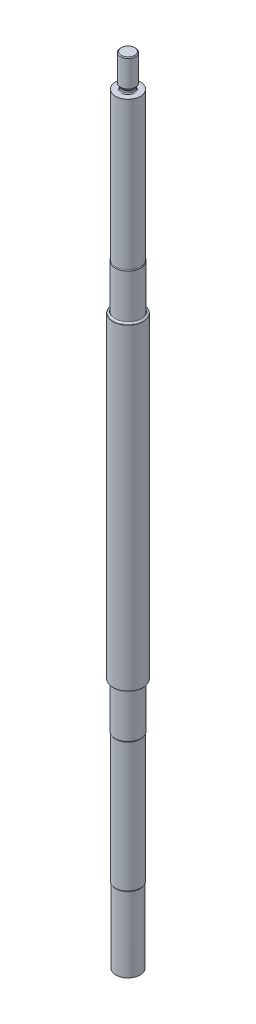
ISO-10303-21;
HEADER;
FILE_DESCRIPTION(('STEP AP214'),'2;1');
FILE_NAME('part.step','',(''),(''),'','','');
FILE_SCHEMA(('AUTOMOTIVE_DESIGN { 1 0 10303 214 1 1 1 1 }'));
ENDSEC;
DATA;
#1=APPLICATION_CONTEXT('core data for automotive mechanical design processes');
#2=APPLICATION_PROTOCOL_DEFINITION('international standard','automotive_design',2000,#1);
#3=PRODUCT_CONTEXT('',#1,'mechanical');
#4=PRODUCT('Part','Part','',(#3));
#5=PRODUCT_RELATED_PRODUCT_CATEGORY('part','',(#4));
#6=PRODUCT_DEFINITION_FORMATION('','',#4);
#7=PRODUCT_DEFINITION_CONTEXT('part definition',#1,'design');
#8=PRODUCT_DEFINITION('design','',#6,#7);
#9=PRODUCT_DEFINITION_SHAPE('','',#8);
#10=(LENGTH_UNIT() NAMED_UNIT(*) SI_UNIT(.MILLI.,.METRE.));
#11=(NAMED_UNIT(*) PLANE_ANGLE_UNIT() SI_UNIT($,.RADIAN.));
#12=(NAMED_UNIT(*) SI_UNIT($,.STERADIAN.) SOLID_ANGLE_UNIT());
#13=UNCERTAINTY_MEASURE_WITH_UNIT(LENGTH_MEASURE(1.E-05),#10,'distance_accuracy_value','');
#14=(GEOMETRIC_REPRESENTATION_CONTEXT(3) GLOBAL_UNCERTAINTY_ASSIGNED_CONTEXT((#13)) GLOBAL_UNIT_ASSIGNED_CONTEXT((#10,
#11,#12)) REPRESENTATION_CONTEXT('',''));
#15=CARTESIAN_POINT('',(0.,0.,0.));
#16=DIRECTION('',(0.,0.,1.));
#17=DIRECTION('',(1.,0.,0.));
#18=AXIS2_PLACEMENT_3D('',#15,#16,#17);
#19=CARTESIAN_POINT('',(0.,50.,0.));
#20=DIRECTION('',(0.,-1.,0.));
#21=DIRECTION('',(0.,0.,-1.));
#22=AXIS2_PLACEMENT_3D('',#19,#20,#21);
#23=CYLINDRICAL_SURFACE('',#22,8.);
#24=CARTESIAN_POINT('',(0.,49.3385621722339,0.));
#25=DIRECTION('',(0.,1.,0.));
#26=DIRECTION('',(0.,0.,1.));
#27=AXIS2_PLACEMENT_3D('',#24,#25,#26);
#28=CIRCLE('',#27,8.);
#29=CARTESIAN_POINT('',(0.,49.3385621722339,8.));
#30=VERTEX_POINT('',#29);
#31=EDGE_CURVE('E11',#30,#30,#28,.F.);
#32=ORIENTED_EDGE('',*,*,#31,.T.);
#33=EDGE_LOOP('',(#32));
#34=FACE_BOUND('',#33,.T.);
#35=CARTESIAN_POINT('',(0.,0.,0.));
#36=DIRECTION('',(0.,1.,0.));
#37=DIRECTION('',(0.,0.,1.));
#38=AXIS2_PLACEMENT_3D('',#35,#36,#37);
#39=CIRCLE('',#38,8.);
#40=CARTESIAN_POINT('',(-3.,0.,-7.41619848709566));
#41=VERTEX_POINT('',#40);
#42=CARTESIAN_POINT('',(3.,0.,-7.41619848709566));
#43=VERTEX_POINT('',#42);
#44=EDGE_CURVE('E173',#41,#43,#39,.T.);
#45=ORIENTED_EDGE('',*,*,#44,.T.);
#46=DIRECTION('',(0.,-1.,0.));
#47=VECTOR('',#46,1.);
#48=CARTESIAN_POINT('',(3.,50.,-7.41619848709566));
#49=LINE('',#48,#47);
#50=CARTESIAN_POINT('',(3.,11.,-7.41619848709566));
#51=VERTEX_POINT('',#50);
#52=EDGE_CURVE('E68',#43,#51,#49,.F.);
#53=ORIENTED_EDGE('',*,*,#52,.T.);
#54=CARTESIAN_POINT('',(3.,11.,-7.41619848709566));
#55=CARTESIAN_POINT('',(3.00001150247641,11.0811624449882,-7.41618329421387));
#56=CARTESIAN_POINT('',(2.99670661735624,11.1623165499388,-7.4175304788967));
#57=CARTESIAN_POINT('',(2.98355385410615,11.3239803822951,-7.42283625204767));
#58=CARTESIAN_POINT('',(2.97370817282642,11.4044903168721,-7.42679396371774));
#59=CARTESIAN_POINT('',(2.94760979888304,11.5640103506357,-7.43718913495));
#60=CARTESIAN_POINT('',(2.93137992723326,11.6430247527342,-7.44361776009885));
#61=CARTESIAN_POINT('',(2.89268899794145,11.7992724273597,-7.45873846840476));
#62=CARTESIAN_POINT('',(2.87022762338732,11.8765056090838,-7.46743066667773));
#63=CARTESIAN_POINT('',(2.79382748302786,12.1046134278335,-7.49650104432074));
#64=CARTESIAN_POINT('',(2.73082546455866,12.2521810126844,-7.51989303640964));
#65=CARTESIAN_POINT('',(2.58267582298604,12.5346997123011,-7.57204865479857));
#66=CARTESIAN_POINT('',(2.49751007462121,12.6696403775369,-7.60081667210073));
#67=CARTESIAN_POINT('',(2.30293382930711,12.9297745049476,-7.66207154206046));
#68=CARTESIAN_POINT('',(2.19260586782619,13.0542575243366,-7.69466741280605));
#69=CARTESIAN_POINT('',(1.95278869988833,13.2834496908188,-7.75899570966101));
#70=CARTESIAN_POINT('',(1.82329579298115,13.3881550102414,-7.79072796761632));
#71=CARTESIAN_POINT('',(1.54338757171269,13.5782797237389,-7.85105785862141));
#72=CARTESIAN_POINT('',(1.39240997283587,13.6629210125665,-7.87951196244675));
#73=CARTESIAN_POINT('',(1.07710720930442,13.8053040108962,-7.92876071159696));
#74=CARTESIAN_POINT('',(0.912787047982169,13.8630557495123,-7.94955821203216));
#75=CARTESIAN_POINT('',(0.582980110011807,13.9475153892843,-7.9803738079676));
#76=CARTESIAN_POINT('',(0.417849300032702,13.9754547521457,-7.99081812162104));
#77=CARTESIAN_POINT('',(0.0849316755533857,14.0034424123212,-8.00128028076469));
#78=CARTESIAN_POINT('',(-0.0828543058596915,14.0034992910932,-8.0013013342463));
#79=CARTESIAN_POINT('',(-0.407488202261083,13.976436370918,-7.99118528299379));
#80=CARTESIAN_POINT('',(-0.56446657549841,13.9506609996028,-7.98155070187544));
#81=CARTESIAN_POINT('',(-0.871680542257435,13.8749275077608,-7.95386524687798));
#82=CARTESIAN_POINT('',(-1.02191575236408,13.8249680140277,-7.9358138950857));
#83=CARTESIAN_POINT('',(-1.3139778717388,13.7016590288194,-7.89275540648327));
#84=CARTESIAN_POINT('',(-1.45565053647605,13.6279796202327,-7.86765083491917));
#85=CARTESIAN_POINT('',(-1.72497274825271,13.4596166230014,-7.81302630429279));
#86=CARTESIAN_POINT('',(-1.85261771444898,13.3649262033605,-7.78350491027405));
#87=CARTESIAN_POINT('',(-2.09817255705866,13.1507509777477,-7.72105277880021));
#88=CARTESIAN_POINT('',(-2.21507771422335,13.0301406539004,-7.68802362154425));
#89=CARTESIAN_POINT('',(-2.4273923733472,12.7708423128226,-7.6236539993798));
#90=CARTESIAN_POINT('',(-2.52279342650006,12.6321472238833,-7.59231420187511));
#91=CARTESIAN_POINT('',(-2.69136811228868,12.3364434715973,-7.53423615367637));
#92=CARTESIAN_POINT('',(-2.76398796570972,12.1790905322608,-7.5076185202358));
#93=CARTESIAN_POINT('',(-2.85192253834713,11.9349057410412,-7.47445645209119));
#94=CARTESIAN_POINT('',(-2.87773161974418,11.8521699480213,-7.4645312113993));
#95=CARTESIAN_POINT('',(-2.92214252998089,11.6845342716744,-7.44725807921765));
#96=CARTESIAN_POINT('',(-2.9407476115028,11.5996353835059,-7.43990902469479));
#97=CARTESIAN_POINT('',(-2.97037457126447,11.4292647372993,-7.42813167576345));
#98=CARTESIAN_POINT('',(-2.98147513434607,11.343808721024,-7.42367309574554));
#99=CARTESIAN_POINT('',(-2.99629160883003,11.1722384946445,-7.41769829849113));
#100=CARTESIAN_POINT('',(-3.000014383647,11.0861249711586,-7.41617934660599));
#101=CARTESIAN_POINT('',(-3.,11.,-7.41619848709566));
#102=B_SPLINE_CURVE_WITH_KNOTS('',3,(#54,#55,#56,#57,#58,#59,#60,#61,#62,#63,#64,#65,#66,#67,
#68,#69,#70,#71,#72,#73,#74,#75,#76,#77,#78,#79,#80,#81,#82,#83,#84,#85,#86,#87,#88,#89,#90,#91,
#92,#93,#94,#95,#96,#97,#98,#99,#100,#101),.UNSPECIFIED.,.F.,.F.,(4,2,2,2,2,2,2,2,2,2,2,2,2,2,2,
2,2,2,2,2,2,2,2,4),(0.,0.243394931332375,0.486708155172838,0.729159418642528,0.971623014582999,
1.45569332924434,1.94016076226287,2.44639743378844,2.95273197950298,3.47630767422025,
3.9996879318651,4.50049538938436,5.00114871211392,5.47703219828147,5.95294270890935,
6.43578138823396,6.91877727629378,7.42999676443292,7.94141675825196,8.46444709431861,
8.72585166683366,8.98713807440335,9.24564054700922,9.50390242663781),.UNSPECIFIED.);
#103=CARTESIAN_POINT('',(-3.,11.,-7.41619848709566));
#104=VERTEX_POINT('',#103);
#105=EDGE_CURVE('E185',#51,#104,#102,.T.);
#106=ORIENTED_EDGE('',*,*,#105,.T.);
#107=DIRECTION('',(0.,-1.,0.));
#108=VECTOR('',#107,1.);
#109=CARTESIAN_POINT('',(-3.,50.,-7.41619848709566));
#110=LINE('',#109,#108);
#111=EDGE_CURVE('E95',#104,#41,#110,.T.);
#112=ORIENTED_EDGE('',*,*,#111,.T.);
#113=EDGE_LOOP('',(#45,#53,#106,#112));
#114=FACE_BOUND('',#113,.T.);
#115=ADVANCED_FACE('F45',(#34,#114),#23,.T.);
#116=CARTESIAN_POINT('',(0.,0.,0.));
#117=DIRECTION('',(0.,1.,0.));
#118=DIRECTION('',(0.,0.,1.));
#119=AXIS2_PLACEMENT_3D('',#116,#117,#118);
#120=PLANE('',#119);
#121=DIRECTION('',(-1.,0.,0.));
#122=VECTOR('',#121,1.);
#123=CARTESIAN_POINT('',(0.,0.,-3.2));
#124=LINE('',#123,#122);
#125=CARTESIAN_POINT('',(3.,0.,-3.2));
#126=VERTEX_POINT('',#125);
#127=CARTESIAN_POINT('',(-3.,0.,-3.2));
#128=VERTEX_POINT('',#127);
#129=EDGE_CURVE('E105',#126,#128,#124,.T.);
#130=ORIENTED_EDGE('',*,*,#129,.F.);
#131=DIRECTION('',(0.,0.,-1.));
#132=VECTOR('',#131,1.);
#133=CARTESIAN_POINT('',(3.,0.,0.));
#134=LINE('',#133,#132);
#135=EDGE_CURVE('E182',#126,#43,#134,.T.);
#136=ORIENTED_EDGE('',*,*,#135,.T.);
#137=ORIENTED_EDGE('',*,*,#44,.F.);
#138=DIRECTION('',(0.,0.,1.));
#139=VECTOR('',#138,1.);
#140=CARTESIAN_POINT('',(-3.,0.,0.));
#141=LINE('',#140,#139);
#142=EDGE_CURVE('E179',#41,#128,#141,.T.);
#143=ORIENTED_EDGE('',*,*,#142,.T.);
#144=EDGE_LOOP('',(#130,#136,#137,#143));
#145=FACE_BOUND('',#144,.T.);
#146=ADVANCED_FACE('F263',(#145),#120,.F.);
#147=CARTESIAN_POINT('',(0.,136.,0.));
#148=DIRECTION('',(0.,-1.,0.));
#149=DIRECTION('',(0.,0.,-1.));
#150=AXIS2_PLACEMENT_3D('',#147,#148,#149);
#151=CYLINDRICAL_SURFACE('',#150,8.25);
#152=CARTESIAN_POINT('',(0.,135.338562172234,0.));
#153=DIRECTION('',(0.,1.,0.));
#154=DIRECTION('',(0.,0.,1.));
#155=AXIS2_PLACEMENT_3D('',#152,#153,#154);
#156=CIRCLE('',#155,8.25);
#157=CARTESIAN_POINT('',(0.,135.338562172234,8.25));
#158=VERTEX_POINT('',#157);
#159=EDGE_CURVE('E54',#158,#158,#156,.F.);
#160=ORIENTED_EDGE('',*,*,#159,.T.);
#161=EDGE_LOOP('',(#160));
#162=FACE_BOUND('',#161,.T.);
#163=CARTESIAN_POINT('',(0.,50.,0.));
#164=DIRECTION('',(0.,1.,0.));
#165=DIRECTION('',(0.,0.,1.));
#166=AXIS2_PLACEMENT_3D('',#163,#164,#165);
#167=CIRCLE('',#166,8.25);
#168=CARTESIAN_POINT('',(0.,50.,8.25));
#169=VERTEX_POINT('',#168);
#170=EDGE_CURVE('E169',#169,#169,#167,.T.);
#171=ORIENTED_EDGE('',*,*,#170,.T.);
#172=EDGE_LOOP('',(#171));
#173=FACE_BOUND('',#172,.T.);
#174=ADVANCED_FACE('F260',(#162,#173),#151,.T.);
#175=CARTESIAN_POINT('',(0.,166.,0.));
#176=DIRECTION('',(0.,-1.,0.));
#177=DIRECTION('',(0.,0.,-1.));
#178=AXIS2_PLACEMENT_3D('',#175,#176,#177);
#179=CYLINDRICAL_SURFACE('',#178,8.5);
#180=CARTESIAN_POINT('',(0.,165.,0.));
#181=DIRECTION('',(0.,1.,0.));
#182=DIRECTION('',(0.,0.,1.));
#183=AXIS2_PLACEMENT_3D('',#180,#181,#182);
#184=CIRCLE('',#183,8.5);
#185=CARTESIAN_POINT('',(0.,165.,8.5));
#186=VERTEX_POINT('',#185);
#187=EDGE_CURVE('E308',#186,#186,#184,.F.);
#188=ORIENTED_EDGE('',*,*,#187,.T.);
#189=EDGE_LOOP('',(#188));
#190=FACE_BOUND('',#189,.T.);
#191=CARTESIAN_POINT('',(0.,136.,0.));
#192=DIRECTION('',(0.,1.,0.));
#193=DIRECTION('',(0.,0.,1.));
#194=AXIS2_PLACEMENT_3D('',#191,#192,#193);
#195=CIRCLE('',#194,8.5);
#196=CARTESIAN_POINT('',(0.,136.,8.5));
#197=VERTEX_POINT('',#196);
#198=EDGE_CURVE('E163',#197,#197,#195,.T.);
#199=ORIENTED_EDGE('',*,*,#198,.T.);
#200=EDGE_LOOP('',(#199));
#201=FACE_BOUND('',#200,.T.);
#202=ADVANCED_FACE('F256',(#190,#201),#179,.T.);
#203=CARTESIAN_POINT('',(0.,376.,0.));
#204=DIRECTION('',(0.,-1.,0.));
#205=DIRECTION('',(0.,0.,-1.));
#206=AXIS2_PLACEMENT_3D('',#203,#204,#205);
#207=CYLINDRICAL_SURFACE('',#206,10.);
#208=CARTESIAN_POINT('',(0.,376.,0.));
#209=DIRECTION('',(0.,1.,0.));
#210=DIRECTION('',(0.,0.,1.));
#211=AXIS2_PLACEMENT_3D('',#208,#209,#210);
#212=CIRCLE('',#211,10.);
#213=CARTESIAN_POINT('',(0.,376.,10.));
#214=VERTEX_POINT('',#213);
#215=EDGE_CURVE('E159',#214,#214,#212,.T.);
#216=ORIENTED_EDGE('',*,*,#215,.F.);
#217=EDGE_LOOP('',(#216));
#218=FACE_BOUND('',#217,.T.);
#219=CARTESIAN_POINT('',(0.,166.,0.));
#220=DIRECTION('',(0.,1.,0.));
#221=DIRECTION('',(0.,0.,1.));
#222=AXIS2_PLACEMENT_3D('',#219,#220,#221);
#223=CIRCLE('',#222,10.);
#224=CARTESIAN_POINT('',(0.,166.,10.));
#225=VERTEX_POINT('',#224);
#226=EDGE_CURVE('E158',#225,#225,#223,.T.);
#227=ORIENTED_EDGE('',*,*,#226,.T.);
#228=EDGE_LOOP('',(#227));
#229=FACE_BOUND('',#228,.T.);
#230=ADVANCED_FACE('F249',(#218,#229),#207,.T.);
#231=CARTESIAN_POINT('',(0.,376.,0.));
#232=DIRECTION('',(0.,1.,0.));
#233=DIRECTION('',(0.,0.,1.));
#234=AXIS2_PLACEMENT_3D('',#231,#232,#233);
#235=PLANE('',#234);
#236=CARTESIAN_POINT('',(0.,376.,0.));
#237=DIRECTION('',(0.,1.,0.));
#238=DIRECTION('',(0.,0.,1.));
#239=AXIS2_PLACEMENT_3D('',#236,#237,#238);
#240=CIRCLE('',#239,9.5);
#241=CARTESIAN_POINT('',(0.,376.,9.5));
#242=VERTEX_POINT('',#241);
#243=EDGE_CURVE('E318',#242,#242,#240,.F.);
#244=ORIENTED_EDGE('',*,*,#243,.T.);
#245=EDGE_LOOP('',(#244));
#246=FACE_BOUND('',#245,.T.);
#247=ORIENTED_EDGE('',*,*,#215,.T.);
#248=EDGE_LOOP('',(#247));
#249=FACE_BOUND('',#248,.T.);
#250=ADVANCED_FACE('F246',(#246,#249),#235,.T.);
#251=CARTESIAN_POINT('',(0.,166.,0.));
#252=DIRECTION('',(0.,1.,0.));
#253=DIRECTION('',(0.,0.,1.));
#254=AXIS2_PLACEMENT_3D('',#251,#252,#253);
#255=PLANE('',#254);
#256=CARTESIAN_POINT('',(0.,166.,0.));
#257=DIRECTION('',(0.,1.,0.));
#258=DIRECTION('',(0.,0.,1.));
#259=AXIS2_PLACEMENT_3D('',#256,#257,#258);
#260=CIRCLE('',#259,9.5);
#261=CARTESIAN_POINT('',(0.,166.,9.5));
#262=VERTEX_POINT('',#261);
#263=EDGE_CURVE('E312',#262,#262,#260,.T.);
#264=ORIENTED_EDGE('',*,*,#263,.T.);
#265=EDGE_LOOP('',(#264));
#266=FACE_BOUND('',#265,.T.);
#267=ORIENTED_EDGE('',*,*,#226,.F.);
#268=EDGE_LOOP('',(#267));
#269=FACE_BOUND('',#268,.T.);
#270=ADVANCED_FACE('F244',(#266,#269),#255,.F.);
#271=CARTESIAN_POINT('',(0.,406.,0.));
#272=DIRECTION('',(0.,-1.,0.));
#273=DIRECTION('',(0.,0.,-1.));
#274=AXIS2_PLACEMENT_3D('',#271,#272,#273);
#275=CYLINDRICAL_SURFACE('',#274,8.5);
#276=CARTESIAN_POINT('',(0.,377.,0.));
#277=DIRECTION('',(0.,1.,0.));
#278=DIRECTION('',(0.,0.,1.));
#279=AXIS2_PLACEMENT_3D('',#276,#277,#278);
#280=CIRCLE('',#279,8.5);
#281=CARTESIAN_POINT('',(0.,377.,8.5));
#282=VERTEX_POINT('',#281);
#283=EDGE_CURVE('E321',#282,#282,#280,.T.);
#284=ORIENTED_EDGE('',*,*,#283,.T.);
#285=EDGE_LOOP('',(#284));
#286=FACE_BOUND('',#285,.T.);
#287=CARTESIAN_POINT('',(0.,406.,0.));
#288=DIRECTION('',(0.,1.,0.));
#289=DIRECTION('',(0.,0.,1.));
#290=AXIS2_PLACEMENT_3D('',#287,#288,#289);
#291=CIRCLE('',#290,8.5);
#292=CARTESIAN_POINT('',(0.,406.,8.5));
#293=VERTEX_POINT('',#292);
#294=EDGE_CURVE('E154',#293,#293,#291,.T.);
#295=ORIENTED_EDGE('',*,*,#294,.F.);
#296=EDGE_LOOP('',(#295));
#297=FACE_BOUND('',#296,.T.);
#298=ADVANCED_FACE('F240',(#286,#297),#275,.T.);
#299=CARTESIAN_POINT('',(0.,501.,0.));
#300=DIRECTION('',(0.,-1.,0.));
#301=DIRECTION('',(0.,0.,-1.));
#302=AXIS2_PLACEMENT_3D('',#299,#300,#301);
#303=CYLINDRICAL_SURFACE('',#302,8.25);
#304=CARTESIAN_POINT('',(0.,406.661437827766,0.));
#305=DIRECTION('',(0.,-1.,0.));
#306=DIRECTION('',(0.,0.,-1.));
#307=AXIS2_PLACEMENT_3D('',#304,#305,#306);
#308=CIRCLE('',#307,8.25);
#309=CARTESIAN_POINT('',(0.,406.661437827766,-8.25));
#310=VERTEX_POINT('',#309);
#311=EDGE_CURVE('E194',#310,#310,#308,.F.);
#312=ORIENTED_EDGE('',*,*,#311,.T.);
#313=EDGE_LOOP('',(#312));
#314=FACE_BOUND('',#313,.T.);
#315=CARTESIAN_POINT('',(0.,504.383974596216,0.));
#316=DIRECTION('',(0.,-1.,0.));
#317=DIRECTION('',(0.,0.,-1.));
#318=AXIS2_PLACEMENT_3D('',#315,#316,#317);
#319=CIRCLE('',#318,8.25);
#320=CARTESIAN_POINT('',(0.,504.383974596216,-8.25));
#321=VERTEX_POINT('',#320);
#322=EDGE_CURVE('E130',#321,#321,#319,.T.);
#323=ORIENTED_EDGE('',*,*,#322,.T.);
#324=EDGE_LOOP('',(#323));
#325=FACE_BOUND('',#324,.T.);
#326=ADVANCED_FACE('F233',(#314,#325),#303,.T.);
#327=CARTESIAN_POINT('',(0.,526.,0.));
#328=DIRECTION('',(0.,-1.,0.));
#329=DIRECTION('',(0.,0.,-1.));
#330=AXIS2_PLACEMENT_3D('',#327,#328,#329);
#331=CYLINDRICAL_SURFACE('',#330,5.);
#332=CARTESIAN_POINT('',(0.,508.,0.));
#333=DIRECTION('',(0.,-1.,0.));
#334=DIRECTION('',(0.,0.,-1.));
#335=AXIS2_PLACEMENT_3D('',#332,#333,#334);
#336=CIRCLE('',#335,5.);
#337=CARTESIAN_POINT('',(0.,508.,-5.));
#338=VERTEX_POINT('',#337);
#339=EDGE_CURVE('E150',#338,#338,#336,.T.);
#340=ORIENTED_EDGE('',*,*,#339,.F.);
#341=EDGE_LOOP('',(#340));
#342=FACE_BOUND('',#341,.T.);
#343=CARTESIAN_POINT('',(0.,525.4455,0.));
#344=DIRECTION('',(0.,-1.,0.));
#345=DIRECTION('',(0.,0.,-1.));
#346=AXIS2_PLACEMENT_3D('',#343,#344,#345);
#347=CIRCLE('',#346,5.);
#348=CARTESIAN_POINT('',(0.,525.4455,-5.));
#349=VERTEX_POINT('',#348);
#350=EDGE_CURVE('E122',#349,#349,#347,.T.);
#351=ORIENTED_EDGE('',*,*,#350,.T.);
#352=EDGE_LOOP('',(#351));
#353=FACE_BOUND('',#352,.T.);
#354=ADVANCED_FACE('F229',(#342,#353),#331,.T.);
#355=CARTESIAN_POINT('',(0.,508.,0.));
#356=DIRECTION('',(0.,1.,0.));
#357=DIRECTION('',(0.,0.,1.));
#358=AXIS2_PLACEMENT_3D('',#355,#356,#357);
#359=CONICAL_SURFACE('',#358,5.,0.523598775598265);
#360=CARTESIAN_POINT('',(0.,506.383974596215,0.));
#361=DIRECTION('',(0.,-1.,0.));
#362=DIRECTION('',(0.,0.,-1.));
#363=AXIS2_PLACEMENT_3D('',#360,#361,#362);
#364=CIRCLE('',#363,4.06698729810777);
#365=CARTESIAN_POINT('',(0.,506.383974596215,-4.06698729810777));
#366=VERTEX_POINT('',#365);
#367=EDGE_CURVE('E146',#366,#366,#364,.T.);
#368=ORIENTED_EDGE('',*,*,#367,.F.);
#369=EDGE_LOOP('',(#368));
#370=FACE_BOUND('',#369,.T.);
#371=ORIENTED_EDGE('',*,*,#339,.T.);
#372=EDGE_LOOP('',(#371));
#373=FACE_BOUND('',#372,.T.);
#374=ADVANCED_FACE('F225',(#370,#373),#359,.T.);
#375=CARTESIAN_POINT('',(0.,506.133974596215,0.));
#376=DIRECTION('',(0.,-1.,0.));
#377=DIRECTION('',(0.,0.,-1.));
#378=AXIS2_PLACEMENT_3D('',#375,#376,#377);
#379=TOROIDAL_SURFACE('',#378,4.5,0.500000000000002);
#380=CARTESIAN_POINT('',(0.,506.133974596215,0.));
#381=DIRECTION('',(0.,-1.,0.));
#382=DIRECTION('',(0.,0.,-1.));
#383=AXIS2_PLACEMENT_3D('',#380,#381,#382);
#384=CIRCLE('',#383,4.);
#385=CARTESIAN_POINT('',(0.,506.133974596215,-4.));
#386=VERTEX_POINT('',#385);
#387=EDGE_CURVE('E142',#386,#386,#384,.T.);
#388=ORIENTED_EDGE('',*,*,#387,.F.);
#389=EDGE_LOOP('',(#388));
#390=FACE_BOUND('',#389,.T.);
#391=ORIENTED_EDGE('',*,*,#367,.T.);
#392=EDGE_LOOP('',(#391));
#393=FACE_BOUND('',#392,.T.);
#394=ADVANCED_FACE('F221',(#390,#393),#379,.F.);
#395=CARTESIAN_POINT('',(0.,526.,0.));
#396=DIRECTION('',(0.,-1.,0.));
#397=DIRECTION('',(0.,0.,-1.));
#398=AXIS2_PLACEMENT_3D('',#395,#396,#397);
#399=CYLINDRICAL_SURFACE('',#398,4.);
#400=CARTESIAN_POINT('',(0.,504.883974596215,0.));
#401=DIRECTION('',(0.,-1.,0.));
#402=DIRECTION('',(0.,0.,-1.));
#403=AXIS2_PLACEMENT_3D('',#400,#401,#402);
#404=CIRCLE('',#403,4.);
#405=CARTESIAN_POINT('',(0.,504.883974596215,-4.));
#406=VERTEX_POINT('',#405);
#407=EDGE_CURVE('E138',#406,#406,#404,.T.);
#408=ORIENTED_EDGE('',*,*,#407,.F.);
#409=EDGE_LOOP('',(#408));
#410=FACE_BOUND('',#409,.T.);
#411=ORIENTED_EDGE('',*,*,#387,.T.);
#412=EDGE_LOOP('',(#411));
#413=FACE_BOUND('',#412,.T.);
#414=ADVANCED_FACE('F217',(#410,#413),#399,.T.);
#415=CARTESIAN_POINT('',(0.,504.883974596215,0.));
#416=DIRECTION('',(0.,-1.,0.));
#417=DIRECTION('',(0.,0.,-1.));
#418=AXIS2_PLACEMENT_3D('',#415,#416,#417);
#419=TOROIDAL_SURFACE('',#418,4.5,0.5);
#420=CARTESIAN_POINT('',(0.,504.383974596216,0.));
#421=DIRECTION('',(0.,-1.,0.));
#422=DIRECTION('',(0.,0.,-1.));
#423=AXIS2_PLACEMENT_3D('',#420,#421,#422);
#424=CIRCLE('',#423,4.5);
#425=CARTESIAN_POINT('',(0.,504.383974596216,-4.5));
#426=VERTEX_POINT('',#425);
#427=EDGE_CURVE('E134',#426,#426,#424,.T.);
#428=ORIENTED_EDGE('',*,*,#427,.F.);
#429=EDGE_LOOP('',(#428));
#430=FACE_BOUND('',#429,.T.);
#431=ORIENTED_EDGE('',*,*,#407,.T.);
#432=EDGE_LOOP('',(#431));
#433=FACE_BOUND('',#432,.T.);
#434=ADVANCED_FACE('F213',(#430,#433),#419,.F.);
#435=CARTESIAN_POINT('',(4.5,504.383974596216,0.));
#436=DIRECTION('',(0.,-1.,0.));
#437=DIRECTION('',(0.,0.,-1.));
#438=AXIS2_PLACEMENT_3D('',#435,#436,#437);
#439=PLANE('',#438);
#440=ORIENTED_EDGE('',*,*,#322,.F.);
#441=EDGE_LOOP('',(#440));
#442=FACE_BOUND('',#441,.T.);
#443=ORIENTED_EDGE('',*,*,#427,.T.);
#444=EDGE_LOOP('',(#443));
#445=FACE_BOUND('',#444,.T.);
#446=ADVANCED_FACE('F209',(#442,#445),#439,.F.);
#447=CARTESIAN_POINT('',(0.,526.,0.));
#448=DIRECTION('',(0.,-1.,0.));
#449=DIRECTION('',(0.,0.,-1.));
#450=AXIS2_PLACEMENT_3D('',#447,#448,#449);
#451=CONICAL_SURFACE('',#450,4.4455,0.785398163397437);
#452=ORIENTED_EDGE('',*,*,#350,.F.);
#453=EDGE_LOOP('',(#452));
#454=FACE_BOUND('',#453,.T.);
#455=CARTESIAN_POINT('',(0.,526.,0.));
#456=DIRECTION('',(0.,-1.,0.));
#457=DIRECTION('',(0.,0.,-1.));
#458=AXIS2_PLACEMENT_3D('',#455,#456,#457);
#459=CIRCLE('',#458,4.4455);
#460=CARTESIAN_POINT('',(0.,526.,-4.4455));
#461=VERTEX_POINT('',#460);
#462=EDGE_CURVE('E126',#461,#461,#459,.T.);
#463=ORIENTED_EDGE('',*,*,#462,.T.);
#464=EDGE_LOOP('',(#463));
#465=FACE_BOUND('',#464,.T.);
#466=ADVANCED_FACE('F206',(#454,#465),#451,.T.);
#467=CARTESIAN_POINT('',(0.,526.,0.));
#468=DIRECTION('',(0.,1.,0.));
#469=DIRECTION('',(0.,0.,1.));
#470=AXIS2_PLACEMENT_3D('',#467,#468,#469);
#471=PLANE('',#470);
#472=ORIENTED_EDGE('',*,*,#462,.F.);
#473=EDGE_LOOP('',(#472));
#474=FACE_BOUND('',#473,.T.);
#475=ADVANCED_FACE('F204',(#474),#471,.T.);
#476=CARTESIAN_POINT('',(0.,11.,-10.));
#477=DIRECTION('',(0.,0.,1.));
#478=DIRECTION('',(1.,0.,0.));
#479=AXIS2_PLACEMENT_3D('',#476,#477,#478);
#480=CYLINDRICAL_SURFACE('',#479,3.);
#481=DIRECTION('',(0.,0.,1.));
#482=VECTOR('',#481,1.);
#483=CARTESIAN_POINT('',(3.,11.,-10.));
#484=LINE('',#483,#482);
#485=CARTESIAN_POINT('',(3.,11.,-3.2));
#486=VERTEX_POINT('',#485);
#487=EDGE_CURVE('E100',#51,#486,#484,.T.);
#488=ORIENTED_EDGE('',*,*,#487,.T.);
#489=CARTESIAN_POINT('',(0.,11.,-3.2));
#490=DIRECTION('',(0.,0.,1.));
#491=DIRECTION('',(-1.,0.,0.));
#492=AXIS2_PLACEMENT_3D('',#489,#490,#491);
#493=CIRCLE('',#492,3.);
#494=CARTESIAN_POINT('',(-3.,11.,-3.2));
#495=VERTEX_POINT('',#494);
#496=EDGE_CURVE('E103',#486,#495,#493,.T.);
#497=ORIENTED_EDGE('',*,*,#496,.T.);
#498=DIRECTION('',(0.,0.,1.));
#499=VECTOR('',#498,1.);
#500=CARTESIAN_POINT('',(-3.,11.,-10.));
#501=LINE('',#500,#499);
#502=EDGE_CURVE('E89',#104,#495,#501,.T.);
#503=ORIENTED_EDGE('',*,*,#502,.F.);
#504=ORIENTED_EDGE('',*,*,#105,.F.);
#505=EDGE_LOOP('',(#488,#497,#503,#504));
#506=FACE_BOUND('',#505,.T.);
#507=ADVANCED_FACE('F108',(#506),#480,.F.);
#508=CARTESIAN_POINT('',(3.,-11.,-10.));
#509=DIRECTION('',(1.,0.,0.));
#510=DIRECTION('',(0.,0.,-1.));
#511=AXIS2_PLACEMENT_3D('',#508,#509,#510);
#512=PLANE('',#511);
#513=ORIENTED_EDGE('',*,*,#135,.F.);
#514=DIRECTION('',(0.,1.,0.));
#515=VECTOR('',#514,1.);
#516=CARTESIAN_POINT('',(3.,-11.,-3.2));
#517=LINE('',#516,#515);
#518=EDGE_CURVE('E61',#126,#486,#517,.T.);
#519=ORIENTED_EDGE('',*,*,#518,.T.);
#520=ORIENTED_EDGE('',*,*,#487,.F.);
#521=ORIENTED_EDGE('',*,*,#52,.F.);
#522=EDGE_LOOP('',(#513,#519,#520,#521));
#523=FACE_BOUND('',#522,.T.);
#524=ADVANCED_FACE('F203',(#523),#512,.F.);
#525=CARTESIAN_POINT('',(-3.,-11.,-10.));
#526=DIRECTION('',(-1.,0.,0.));
#527=DIRECTION('',(0.,0.,1.));
#528=AXIS2_PLACEMENT_3D('',#525,#526,#527);
#529=PLANE('',#528);
#530=ORIENTED_EDGE('',*,*,#502,.T.);
#531=DIRECTION('',(0.,-1.,0.));
#532=VECTOR('',#531,1.);
#533=CARTESIAN_POINT('',(-3.,-11.,-3.2));
#534=LINE('',#533,#532);
#535=EDGE_CURVE('E92',#495,#128,#534,.T.);
#536=ORIENTED_EDGE('',*,*,#535,.T.);
#537=ORIENTED_EDGE('',*,*,#142,.F.);
#538=ORIENTED_EDGE('',*,*,#111,.F.);
#539=EDGE_LOOP('',(#530,#536,#537,#538));
#540=FACE_BOUND('',#539,.T.);
#541=ADVANCED_FACE('F91',(#540),#529,.F.);
#542=CARTESIAN_POINT('',(0.,11.,-3.2));
#543=DIRECTION('',(0.,0.,-1.));
#544=DIRECTION('',(-1.,0.,0.));
#545=AXIS2_PLACEMENT_3D('',#542,#543,#544);
#546=PLANE('',#545);
#547=ORIENTED_EDGE('',*,*,#129,.T.);
#548=ORIENTED_EDGE('',*,*,#535,.F.);
#549=ORIENTED_EDGE('',*,*,#496,.F.);
#550=ORIENTED_EDGE('',*,*,#518,.F.);
#551=EDGE_LOOP('',(#547,#548,#549,#550));
#552=FACE_BOUND('',#551,.T.);
#553=ADVANCED_FACE('F102',(#552),#546,.T.);
#554=CARTESIAN_POINT('',(0.,406.661437827766,0.));
#555=DIRECTION('',(0.,-1.,0.));
#556=DIRECTION('',(0.,0.,-1.));
#557=AXIS2_PLACEMENT_3D('',#554,#555,#556);
#558=TOROIDAL_SURFACE('',#557,9.25,1.);
#559=ORIENTED_EDGE('',*,*,#294,.T.);
#560=EDGE_LOOP('',(#559));
#561=FACE_BOUND('',#560,.T.);
#562=ORIENTED_EDGE('',*,*,#311,.F.);
#563=EDGE_LOOP('',(#562));
#564=FACE_BOUND('',#563,.T.);
#565=ADVANCED_FACE('F279',(#561,#564),#558,.F.);
#566=CARTESIAN_POINT('',(0.,377.,0.));
#567=DIRECTION('',(0.,1.,0.));
#568=DIRECTION('',(0.,0.,1.));
#569=AXIS2_PLACEMENT_3D('',#566,#567,#568);
#570=TOROIDAL_SURFACE('',#569,9.5,1.);
#571=ORIENTED_EDGE('',*,*,#243,.F.);
#572=EDGE_LOOP('',(#571));
#573=FACE_BOUND('',#572,.T.);
#574=ORIENTED_EDGE('',*,*,#283,.F.);
#575=EDGE_LOOP('',(#574));
#576=FACE_BOUND('',#575,.T.);
#577=ADVANCED_FACE('F283',(#573,#576),#570,.F.);
#578=CARTESIAN_POINT('',(0.,165.,0.));
#579=DIRECTION('',(0.,1.,0.));
#580=DIRECTION('',(0.,0.,1.));
#581=AXIS2_PLACEMENT_3D('',#578,#579,#580);
#582=TOROIDAL_SURFACE('',#581,9.5,1.);
#583=ORIENTED_EDGE('',*,*,#187,.F.);
#584=EDGE_LOOP('',(#583));
#585=FACE_BOUND('',#584,.T.);
#586=ORIENTED_EDGE('',*,*,#263,.F.);
#587=EDGE_LOOP('',(#586));
#588=FACE_BOUND('',#587,.T.);
#589=ADVANCED_FACE('F288',(#585,#588),#582,.F.);
#590=CARTESIAN_POINT('',(0.,135.338562172234,0.));
#591=DIRECTION('',(0.,1.,0.));
#592=DIRECTION('',(0.,0.,1.));
#593=AXIS2_PLACEMENT_3D('',#590,#591,#592);
#594=TOROIDAL_SURFACE('',#593,9.25,1.);
#595=ORIENTED_EDGE('',*,*,#159,.F.);
#596=EDGE_LOOP('',(#595));
#597=FACE_BOUND('',#596,.T.);
#598=ORIENTED_EDGE('',*,*,#198,.F.);
#599=EDGE_LOOP('',(#598));
#600=FACE_BOUND('',#599,.T.);
#601=ADVANCED_FACE('F294',(#597,#600),#594,.F.);
#602=CARTESIAN_POINT('',(0.,49.3385621722339,0.));
#603=DIRECTION('',(0.,1.,0.));
#604=DIRECTION('',(0.,0.,1.));
#605=AXIS2_PLACEMENT_3D('',#602,#603,#604);
#606=TOROIDAL_SURFACE('',#605,9.,1.);
#607=ORIENTED_EDGE('',*,*,#31,.F.);
#608=EDGE_LOOP('',(#607));
#609=FACE_BOUND('',#608,.T.);
#610=ORIENTED_EDGE('',*,*,#170,.F.);
#611=EDGE_LOOP('',(#610));
#612=FACE_BOUND('',#611,.T.);
#613=ADVANCED_FACE('F47',(#609,#612),#606,.F.);
#614=CLOSED_SHELL('',(#115,#146,#174,#202,#230,#250,#270,#298,#326,#354,#374,#394,#414,#434,
#446,#466,#475,#507,#524,#541,#553,#565,#577,#589,#601,#613));
#615=MANIFOLD_SOLID_BREP('B2',#614);
#616=ADVANCED_BREP_SHAPE_REPRESENTATION('',(#18,#615),#14);
#617=SHAPE_DEFINITION_REPRESENTATION(#9,#616);
ENDSEC;
END-ISO-10303-21;
